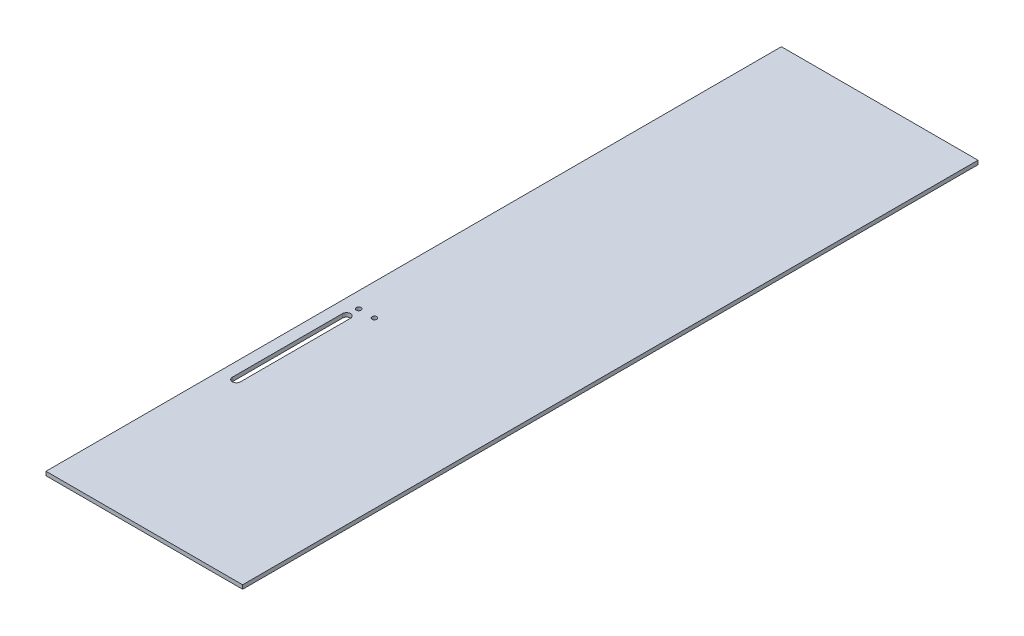
ISO-10303-21;
HEADER;
FILE_DESCRIPTION(('STEP AP214'),'2;1');
FILE_NAME('part.step','',(''),(''),'','','');
FILE_SCHEMA(('AUTOMOTIVE_DESIGN { 1 0 10303 214 1 1 1 1 }'));
ENDSEC;
DATA;
#1=APPLICATION_CONTEXT('core data for automotive mechanical design processes');
#2=APPLICATION_PROTOCOL_DEFINITION('international standard','automotive_design',2000,#1);
#3=PRODUCT_CONTEXT('',#1,'mechanical');
#4=PRODUCT('Part','Part','',(#3));
#5=PRODUCT_RELATED_PRODUCT_CATEGORY('part','',(#4));
#6=PRODUCT_DEFINITION_FORMATION('','',#4);
#7=PRODUCT_DEFINITION_CONTEXT('part definition',#1,'design');
#8=PRODUCT_DEFINITION('design','',#6,#7);
#9=PRODUCT_DEFINITION_SHAPE('','',#8);
#10=(LENGTH_UNIT() NAMED_UNIT(*) SI_UNIT(.MILLI.,.METRE.));
#11=(NAMED_UNIT(*) PLANE_ANGLE_UNIT() SI_UNIT($,.RADIAN.));
#12=(NAMED_UNIT(*) SI_UNIT($,.STERADIAN.) SOLID_ANGLE_UNIT());
#13=UNCERTAINTY_MEASURE_WITH_UNIT(LENGTH_MEASURE(1.E-05),#10,'distance_accuracy_value','');
#14=(GEOMETRIC_REPRESENTATION_CONTEXT(3) GLOBAL_UNCERTAINTY_ASSIGNED_CONTEXT((#13)) GLOBAL_UNIT_ASSIGNED_CONTEXT((#10,
#11,#12)) REPRESENTATION_CONTEXT('',''));
#15=CARTESIAN_POINT('',(0.,0.,0.));
#16=DIRECTION('',(0.,0.,1.));
#17=DIRECTION('',(1.,0.,0.));
#18=AXIS2_PLACEMENT_3D('',#15,#16,#17);
#19=CARTESIAN_POINT('',(79.3750000000002,3.17499999999998,296.8625));
#20=DIRECTION('',(-1.,0.,0.));
#21=DIRECTION('',(0.,0.,1.));
#22=AXIS2_PLACEMENT_3D('',#19,#20,#21);
#23=PLANE('',#22);
#24=DIRECTION('',(0.,0.,-1.));
#25=VECTOR('',#24,1.);
#26=CARTESIAN_POINT('',(79.3750000000002,0.,296.8625));
#27=LINE('',#26,#25);
#28=CARTESIAN_POINT('',(79.3750000000002,0.,296.8625));
#29=VERTEX_POINT('',#28);
#30=CARTESIAN_POINT('',(79.3750000000002,0.,-296.8625));
#31=VERTEX_POINT('',#30);
#32=EDGE_CURVE('E177',#29,#31,#27,.T.);
#33=ORIENTED_EDGE('',*,*,#32,.T.);
#34=DIRECTION('',(0.,-1.,0.));
#35=VECTOR('',#34,1.);
#36=CARTESIAN_POINT('',(79.3750000000002,3.17500000000001,-296.8625));
#37=LINE('',#36,#35);
#38=CARTESIAN_POINT('',(79.3750000000002,3.17500000000001,-296.8625));
#39=VERTEX_POINT('',#38);
#40=EDGE_CURVE('E11',#39,#31,#37,.T.);
#41=ORIENTED_EDGE('',*,*,#40,.F.);
#42=DIRECTION('',(0.,0.,-1.));
#43=VECTOR('',#42,1.);
#44=CARTESIAN_POINT('',(79.3750000000002,3.17499999999998,296.8625));
#45=LINE('',#44,#43);
#46=CARTESIAN_POINT('',(79.3750000000002,3.17499999999998,296.8625));
#47=VERTEX_POINT('',#46);
#48=EDGE_CURVE('E162',#47,#39,#45,.T.);
#49=ORIENTED_EDGE('',*,*,#48,.F.);
#50=DIRECTION('',(0.,-1.,0.));
#51=VECTOR('',#50,1.);
#52=CARTESIAN_POINT('',(79.3750000000002,3.17499999999998,296.8625));
#53=LINE('',#52,#51);
#54=EDGE_CURVE('E176',#47,#29,#53,.T.);
#55=ORIENTED_EDGE('',*,*,#54,.T.);
#56=EDGE_LOOP('',(#33,#41,#49,#55));
#57=FACE_BOUND('',#56,.T.);
#58=ADVANCED_FACE('F38',(#57),#23,.F.);
#59=CARTESIAN_POINT('',(-79.3750000000001,3.17500000000001,-296.8625));
#60=DIRECTION('',(0.,0.,1.));
#61=DIRECTION('',(1.,0.,0.));
#62=AXIS2_PLACEMENT_3D('',#59,#60,#61);
#63=PLANE('',#62);
#64=DIRECTION('',(-1.,0.,0.));
#65=VECTOR('',#64,1.);
#66=CARTESIAN_POINT('',(-79.3750000000001,0.,-296.8625));
#67=LINE('',#66,#65);
#68=CARTESIAN_POINT('',(-79.3750000000001,0.,-296.8625));
#69=VERTEX_POINT('',#68);
#70=EDGE_CURVE('E181',#31,#69,#67,.T.);
#71=ORIENTED_EDGE('',*,*,#70,.T.);
#72=DIRECTION('',(0.,-1.,0.));
#73=VECTOR('',#72,1.);
#74=CARTESIAN_POINT('',(-79.3750000000001,3.17500000000001,-296.8625));
#75=LINE('',#74,#73);
#76=CARTESIAN_POINT('',(-79.3750000000001,3.17500000000001,-296.8625));
#77=VERTEX_POINT('',#76);
#78=EDGE_CURVE('E47',#77,#69,#75,.T.);
#79=ORIENTED_EDGE('',*,*,#78,.F.);
#80=DIRECTION('',(-1.,0.,0.));
#81=VECTOR('',#80,1.);
#82=CARTESIAN_POINT('',(-79.3750000000001,3.17500000000001,-296.8625));
#83=LINE('',#82,#81);
#84=EDGE_CURVE('E166',#39,#77,#83,.T.);
#85=ORIENTED_EDGE('',*,*,#84,.F.);
#86=ORIENTED_EDGE('',*,*,#40,.T.);
#87=EDGE_LOOP('',(#71,#79,#85,#86));
#88=FACE_BOUND('',#87,.T.);
#89=ADVANCED_FACE('F225',(#88),#63,.F.);
#90=CARTESIAN_POINT('',(-79.3750000000001,3.17500000000001,296.8625));
#91=DIRECTION('',(1.,0.,0.));
#92=DIRECTION('',(0.,0.,-1.));
#93=AXIS2_PLACEMENT_3D('',#90,#91,#92);
#94=PLANE('',#93);
#95=DIRECTION('',(0.,0.,1.));
#96=VECTOR('',#95,1.);
#97=CARTESIAN_POINT('',(-79.3750000000001,0.,296.8625));
#98=LINE('',#97,#96);
#99=CARTESIAN_POINT('',(-79.3750000000001,0.,296.8625));
#100=VERTEX_POINT('',#99);
#101=EDGE_CURVE('E184',#69,#100,#98,.T.);
#102=ORIENTED_EDGE('',*,*,#101,.T.);
#103=DIRECTION('',(0.,-1.,0.));
#104=VECTOR('',#103,1.);
#105=CARTESIAN_POINT('',(-79.3750000000001,3.17500000000001,296.8625));
#106=LINE('',#105,#104);
#107=CARTESIAN_POINT('',(-79.3750000000001,3.17500000000001,296.8625));
#108=VERTEX_POINT('',#107);
#109=EDGE_CURVE('E192',#108,#100,#106,.T.);
#110=ORIENTED_EDGE('',*,*,#109,.F.);
#111=DIRECTION('',(0.,0.,1.));
#112=VECTOR('',#111,1.);
#113=CARTESIAN_POINT('',(-79.3750000000001,3.17500000000001,296.8625));
#114=LINE('',#113,#112);
#115=EDGE_CURVE('E170',#77,#108,#114,.T.);
#116=ORIENTED_EDGE('',*,*,#115,.F.);
#117=ORIENTED_EDGE('',*,*,#78,.T.);
#118=EDGE_LOOP('',(#102,#110,#116,#117));
#119=FACE_BOUND('',#118,.T.);
#120=ADVANCED_FACE('F222',(#119),#94,.F.);
#121=CARTESIAN_POINT('',(-79.3750000000001,3.17500000000001,296.8625));
#122=DIRECTION('',(0.,0.,-1.));
#123=DIRECTION('',(-1.,0.,0.));
#124=AXIS2_PLACEMENT_3D('',#121,#122,#123);
#125=PLANE('',#124);
#126=DIRECTION('',(1.,0.,0.));
#127=VECTOR('',#126,1.);
#128=CARTESIAN_POINT('',(-79.3750000000001,0.,296.8625));
#129=LINE('',#128,#127);
#130=EDGE_CURVE('E167',#100,#29,#129,.T.);
#131=ORIENTED_EDGE('',*,*,#130,.T.);
#132=ORIENTED_EDGE('',*,*,#54,.F.);
#133=DIRECTION('',(1.,0.,0.));
#134=VECTOR('',#133,1.);
#135=CARTESIAN_POINT('',(-79.3750000000001,3.17500000000001,296.8625));
#136=LINE('',#135,#134);
#137=EDGE_CURVE('E173',#108,#47,#136,.T.);
#138=ORIENTED_EDGE('',*,*,#137,.F.);
#139=ORIENTED_EDGE('',*,*,#109,.T.);
#140=EDGE_LOOP('',(#131,#132,#138,#139));
#141=FACE_BOUND('',#140,.T.);
#142=ADVANCED_FACE('F218',(#141),#125,.F.);
#143=CARTESIAN_POINT('',(0.,3.17500000000001,0.));
#144=DIRECTION('',(0.,-1.,0.));
#145=DIRECTION('',(0.,0.,-1.));
#146=AXIS2_PLACEMENT_3D('',#143,#144,#145);
#147=PLANE('',#146);
#148=DIRECTION('',(0.,0.,1.));
#149=VECTOR('',#148,1.);
#150=CARTESIAN_POINT('',(-69.9388999999992,3.17500000000001,66.9417000092439));
#151=LINE('',#150,#149);
#152=CARTESIAN_POINT('',(-69.9388999999992,3.17500000000001,66.9417000092439));
#153=VERTEX_POINT('',#152);
#154=CARTESIAN_POINT('',(-69.9388999999992,3.17500000000009,155.841700009244));
#155=VERTEX_POINT('',#154);
#156=EDGE_CURVE('E139',#153,#155,#151,.T.);
#157=ORIENTED_EDGE('',*,*,#156,.F.);
#158=CARTESIAN_POINT('',(-66.6749999999992,3.17500000000001,66.9417000092439));
#159=DIRECTION('',(0.,1.,0.));
#160=DIRECTION('',(0.,0.,1.));
#161=AXIS2_PLACEMENT_3D('',#158,#159,#160);
#162=CIRCLE('',#161,3.2639);
#163=CARTESIAN_POINT('',(-63.4110999999992,3.17500000000001,66.9417000092439));
#164=VERTEX_POINT('',#163);
#165=EDGE_CURVE('E55',#164,#153,#162,.T.);
#166=ORIENTED_EDGE('',*,*,#165,.F.);
#167=DIRECTION('',(0.,0.,-1.));
#168=VECTOR('',#167,1.);
#169=CARTESIAN_POINT('',(-63.4110999999992,3.17500000000001,66.9417000092439));
#170=LINE('',#169,#168);
#171=CARTESIAN_POINT('',(-63.4110999999992,3.17500000000009,155.841700009244));
#172=VERTEX_POINT('',#171);
#173=EDGE_CURVE('E126',#172,#164,#170,.T.);
#174=ORIENTED_EDGE('',*,*,#173,.F.);
#175=CARTESIAN_POINT('',(-66.6749999999992,3.17500000000009,155.841700009244));
#176=DIRECTION('',(0.,1.,0.));
#177=DIRECTION('',(0.,0.,1.));
#178=AXIS2_PLACEMENT_3D('',#175,#176,#177);
#179=CIRCLE('',#178,3.2639);
#180=EDGE_CURVE('E130',#155,#172,#179,.T.);
#181=ORIENTED_EDGE('',*,*,#180,.F.);
#182=EDGE_LOOP('',(#157,#166,#174,#181));
#183=FACE_BOUND('',#182,.T.);
#184=CARTESIAN_POINT('',(-66.6749999999991,3.17500000000001,57.0992000092394));
#185=DIRECTION('',(0.,1.,0.));
#186=DIRECTION('',(0.,0.,1.));
#187=AXIS2_PLACEMENT_3D('',#184,#185,#186);
#188=CIRCLE('',#187,1.89865);
#189=CARTESIAN_POINT('',(-66.6749999999991,3.17500000000001,58.9978500092394));
#190=VERTEX_POINT('',#189);
#191=EDGE_CURVE('E148',#190,#190,#188,.T.);
#192=ORIENTED_EDGE('',*,*,#191,.F.);
#193=EDGE_LOOP('',(#192));
#194=FACE_BOUND('',#193,.T.);
#195=CARTESIAN_POINT('',(-53.9749999999991,3.17499999999996,57.0992000092394));
#196=DIRECTION('',(0.,1.,0.));
#197=DIRECTION('',(0.,0.,1.));
#198=AXIS2_PLACEMENT_3D('',#195,#196,#197);
#199=CIRCLE('',#198,1.89864999999999);
#200=CARTESIAN_POINT('',(-53.9749999999991,3.17499999999996,58.9978500092394));
#201=VERTEX_POINT('',#200);
#202=EDGE_CURVE('E157',#201,#201,#199,.T.);
#203=ORIENTED_EDGE('',*,*,#202,.F.);
#204=EDGE_LOOP('',(#203));
#205=FACE_BOUND('',#204,.T.);
#206=ORIENTED_EDGE('',*,*,#48,.T.);
#207=ORIENTED_EDGE('',*,*,#84,.T.);
#208=ORIENTED_EDGE('',*,*,#115,.T.);
#209=ORIENTED_EDGE('',*,*,#137,.T.);
#210=EDGE_LOOP('',(#206,#207,#208,#209));
#211=FACE_BOUND('',#210,.T.);
#212=ADVANCED_FACE('F207',(#183,#194,#205,#211),#147,.F.);
#213=CARTESIAN_POINT('',(0.,0.,0.));
#214=DIRECTION('',(0.,-1.,0.));
#215=DIRECTION('',(0.,0.,-1.));
#216=AXIS2_PLACEMENT_3D('',#213,#214,#215);
#217=PLANE('',#216);
#218=CARTESIAN_POINT('',(-66.6749999999992,0.,66.9417000092439));
#219=DIRECTION('',(0.,1.,0.));
#220=DIRECTION('',(0.,0.,1.));
#221=AXIS2_PLACEMENT_3D('',#218,#219,#220);
#222=CIRCLE('',#221,3.2639);
#223=CARTESIAN_POINT('',(-63.4110999999992,0.,66.9417000092439));
#224=VERTEX_POINT('',#223);
#225=CARTESIAN_POINT('',(-69.9388999999992,0.,66.9417000092439));
#226=VERTEX_POINT('',#225);
#227=EDGE_CURVE('E107',#224,#226,#222,.T.);
#228=ORIENTED_EDGE('',*,*,#227,.T.);
#229=DIRECTION('',(0.,0.,1.));
#230=VECTOR('',#229,1.);
#231=CARTESIAN_POINT('',(-69.9388999999992,0.,66.9417000092439));
#232=LINE('',#231,#230);
#233=CARTESIAN_POINT('',(-69.9388999999992,1.11022302462516E-13,155.841700009244));
#234=VERTEX_POINT('',#233);
#235=EDGE_CURVE('E117',#226,#234,#232,.T.);
#236=ORIENTED_EDGE('',*,*,#235,.T.);
#237=CARTESIAN_POINT('',(-66.6749999999992,1.11022302462516E-13,155.841700009244));
#238=DIRECTION('',(0.,1.,0.));
#239=DIRECTION('',(0.,0.,1.));
#240=AXIS2_PLACEMENT_3D('',#237,#238,#239);
#241=CIRCLE('',#240,3.2639);
#242=CARTESIAN_POINT('',(-63.4110999999992,1.11022302462516E-13,155.841700009244));
#243=VERTEX_POINT('',#242);
#244=EDGE_CURVE('E63',#234,#243,#241,.T.);
#245=ORIENTED_EDGE('',*,*,#244,.T.);
#246=DIRECTION('',(0.,0.,-1.));
#247=VECTOR('',#246,1.);
#248=CARTESIAN_POINT('',(-63.4110999999992,0.,66.9417000092439));
#249=LINE('',#248,#247);
#250=EDGE_CURVE('E114',#243,#224,#249,.T.);
#251=ORIENTED_EDGE('',*,*,#250,.T.);
#252=EDGE_LOOP('',(#228,#236,#245,#251));
#253=FACE_BOUND('',#252,.T.);
#254=CARTESIAN_POINT('',(-66.6749999999991,0.,57.0992000092394));
#255=DIRECTION('',(0.,-1.,0.));
#256=DIRECTION('',(0.,0.,-1.));
#257=AXIS2_PLACEMENT_3D('',#254,#255,#256);
#258=CIRCLE('',#257,1.89865);
#259=CARTESIAN_POINT('',(-66.6749999999991,0.,55.2005500092394));
#260=VERTEX_POINT('',#259);
#261=EDGE_CURVE('E41',#260,#260,#258,.T.);
#262=ORIENTED_EDGE('',*,*,#261,.F.);
#263=EDGE_LOOP('',(#262));
#264=FACE_BOUND('',#263,.T.);
#265=CARTESIAN_POINT('',(-53.9749999999991,-1.11022302462516E-13,57.0992000092394));
#266=DIRECTION('',(0.,-1.,0.));
#267=DIRECTION('',(0.,0.,-1.));
#268=AXIS2_PLACEMENT_3D('',#265,#266,#267);
#269=CIRCLE('',#268,1.89864999999999);
#270=CARTESIAN_POINT('',(-53.9749999999991,-1.11022302462516E-13,55.2005500092394));
#271=VERTEX_POINT('',#270);
#272=EDGE_CURVE('E161',#271,#271,#269,.T.);
#273=ORIENTED_EDGE('',*,*,#272,.F.);
#274=EDGE_LOOP('',(#273));
#275=FACE_BOUND('',#274,.T.);
#276=ORIENTED_EDGE('',*,*,#32,.F.);
#277=ORIENTED_EDGE('',*,*,#130,.F.);
#278=ORIENTED_EDGE('',*,*,#101,.F.);
#279=ORIENTED_EDGE('',*,*,#70,.F.);
#280=EDGE_LOOP('',(#276,#277,#278,#279));
#281=FACE_BOUND('',#280,.T.);
#282=ADVANCED_FACE('F122',(#253,#264,#275,#281),#217,.T.);
#283=CARTESIAN_POINT('',(-53.9749999999991,3.17499999999996,57.0992000092394));
#284=DIRECTION('',(0.,1.,0.));
#285=DIRECTION('',(0.,0.,1.));
#286=AXIS2_PLACEMENT_3D('',#283,#284,#285);
#287=CYLINDRICAL_SURFACE('',#286,1.89864999999999);
#288=ORIENTED_EDGE('',*,*,#272,.T.);
#289=EDGE_LOOP('',(#288));
#290=FACE_BOUND('',#289,.T.);
#291=ORIENTED_EDGE('',*,*,#202,.T.);
#292=EDGE_LOOP('',(#291));
#293=FACE_BOUND('',#292,.T.);
#294=ADVANCED_FACE('F202',(#290,#293),#287,.F.);
#295=CARTESIAN_POINT('',(-66.6749999999991,3.17500000000001,57.0992000092394));
#296=DIRECTION('',(0.,1.,0.));
#297=DIRECTION('',(0.,0.,1.));
#298=AXIS2_PLACEMENT_3D('',#295,#296,#297);
#299=CYLINDRICAL_SURFACE('',#298,1.89865);
#300=ORIENTED_EDGE('',*,*,#261,.T.);
#301=EDGE_LOOP('',(#300));
#302=FACE_BOUND('',#301,.T.);
#303=ORIENTED_EDGE('',*,*,#191,.T.);
#304=EDGE_LOOP('',(#303));
#305=FACE_BOUND('',#304,.T.);
#306=ADVANCED_FACE('F263',(#302,#305),#299,.F.);
#307=CARTESIAN_POINT('',(-66.6749999999992,0.,66.9417000092439));
#308=DIRECTION('',(0.,1.,0.));
#309=DIRECTION('',(0.,0.,1.));
#310=AXIS2_PLACEMENT_3D('',#307,#308,#309);
#311=CYLINDRICAL_SURFACE('',#310,3.2639);
#312=ORIENTED_EDGE('',*,*,#165,.T.);
#313=DIRECTION('',(0.,1.,0.));
#314=VECTOR('',#313,1.);
#315=CARTESIAN_POINT('',(-69.9388999999992,0.,66.9417000092439));
#316=LINE('',#315,#314);
#317=EDGE_CURVE('E103',#226,#153,#316,.T.);
#318=ORIENTED_EDGE('',*,*,#317,.F.);
#319=ORIENTED_EDGE('',*,*,#227,.F.);
#320=DIRECTION('',(0.,1.,0.));
#321=VECTOR('',#320,1.);
#322=CARTESIAN_POINT('',(-63.4110999999992,0.,66.9417000092439));
#323=LINE('',#322,#321);
#324=EDGE_CURVE('E145',#224,#164,#323,.T.);
#325=ORIENTED_EDGE('',*,*,#324,.T.);
#326=EDGE_LOOP('',(#312,#318,#319,#325));
#327=FACE_BOUND('',#326,.T.);
#328=ADVANCED_FACE('F105',(#327),#311,.F.);
#329=CARTESIAN_POINT('',(-63.4110999999992,0.,66.9417000092439));
#330=DIRECTION('',(1.,0.,0.));
#331=DIRECTION('',(0.,0.,-1.));
#332=AXIS2_PLACEMENT_3D('',#329,#330,#331);
#333=PLANE('',#332);
#334=ORIENTED_EDGE('',*,*,#173,.T.);
#335=ORIENTED_EDGE('',*,*,#324,.F.);
#336=ORIENTED_EDGE('',*,*,#250,.F.);
#337=DIRECTION('',(0.,1.,0.));
#338=VECTOR('',#337,1.);
#339=CARTESIAN_POINT('',(-63.4110999999992,1.11022302462516E-13,155.841700009244));
#340=LINE('',#339,#338);
#341=EDGE_CURVE('E149',#243,#172,#340,.T.);
#342=ORIENTED_EDGE('',*,*,#341,.T.);
#343=EDGE_LOOP('',(#334,#335,#336,#342));
#344=FACE_BOUND('',#343,.T.);
#345=ADVANCED_FACE('F276',(#344),#333,.F.);
#346=CARTESIAN_POINT('',(-66.6749999999992,1.11022302462516E-13,155.841700009244));
#347=DIRECTION('',(0.,1.,0.));
#348=DIRECTION('',(0.,0.,1.));
#349=AXIS2_PLACEMENT_3D('',#346,#347,#348);
#350=CYLINDRICAL_SURFACE('',#349,3.2639);
#351=ORIENTED_EDGE('',*,*,#180,.T.);
#352=ORIENTED_EDGE('',*,*,#341,.F.);
#353=ORIENTED_EDGE('',*,*,#244,.F.);
#354=DIRECTION('',(0.,1.,0.));
#355=VECTOR('',#354,1.);
#356=CARTESIAN_POINT('',(-69.9388999999992,1.11022302462516E-13,155.841700009244));
#357=LINE('',#356,#355);
#358=EDGE_CURVE('E113',#234,#155,#357,.T.);
#359=ORIENTED_EDGE('',*,*,#358,.T.);
#360=EDGE_LOOP('',(#351,#352,#353,#359));
#361=FACE_BOUND('',#360,.T.);
#362=ADVANCED_FACE('F283',(#361),#350,.F.);
#363=CARTESIAN_POINT('',(-69.9388999999992,0.,66.9417000092439));
#364=DIRECTION('',(-1.,0.,0.));
#365=DIRECTION('',(0.,0.,1.));
#366=AXIS2_PLACEMENT_3D('',#363,#364,#365);
#367=PLANE('',#366);
#368=ORIENTED_EDGE('',*,*,#156,.T.);
#369=ORIENTED_EDGE('',*,*,#358,.F.);
#370=ORIENTED_EDGE('',*,*,#235,.F.);
#371=ORIENTED_EDGE('',*,*,#317,.T.);
#372=EDGE_LOOP('',(#368,#369,#370,#371));
#373=FACE_BOUND('',#372,.T.);
#374=ADVANCED_FACE('F118',(#373),#367,.F.);
#375=CLOSED_SHELL('',(#58,#89,#120,#142,#212,#282,#294,#306,#328,#345,#362,#374));
#376=MANIFOLD_SOLID_BREP('B2',#375);
#377=ADVANCED_BREP_SHAPE_REPRESENTATION('',(#18,#376),#14);
#378=SHAPE_DEFINITION_REPRESENTATION(#9,#377);
ENDSEC;
END-ISO-10303-21;
